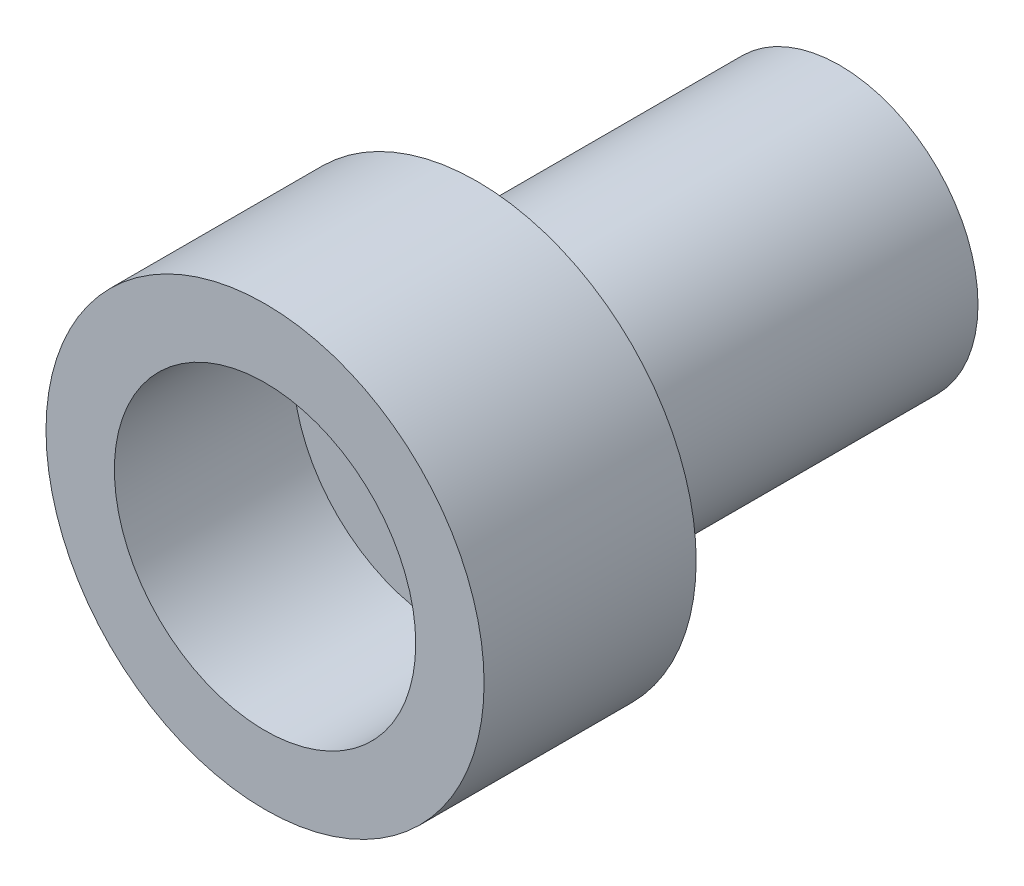
ISO-10303-21;
HEADER;
FILE_DESCRIPTION(('STEP AP214'),'2;1');
FILE_NAME('part.step','',(''),(''),'','','');
FILE_SCHEMA(('AUTOMOTIVE_DESIGN { 1 0 10303 214 1 1 1 1 }'));
ENDSEC;
DATA;
#1=APPLICATION_CONTEXT('core data for automotive mechanical design processes');
#2=APPLICATION_PROTOCOL_DEFINITION('international standard','automotive_design',2000,#1);
#3=PRODUCT_CONTEXT('',#1,'mechanical');
#4=PRODUCT('Part','Part','',(#3));
#5=PRODUCT_RELATED_PRODUCT_CATEGORY('part','',(#4));
#6=PRODUCT_DEFINITION_FORMATION('','',#4);
#7=PRODUCT_DEFINITION_CONTEXT('part definition',#1,'design');
#8=PRODUCT_DEFINITION('design','',#6,#7);
#9=PRODUCT_DEFINITION_SHAPE('','',#8);
#10=(LENGTH_UNIT() NAMED_UNIT(*) SI_UNIT(.MILLI.,.METRE.));
#11=(NAMED_UNIT(*) PLANE_ANGLE_UNIT() SI_UNIT($,.RADIAN.));
#12=(NAMED_UNIT(*) SI_UNIT($,.STERADIAN.) SOLID_ANGLE_UNIT());
#13=UNCERTAINTY_MEASURE_WITH_UNIT(LENGTH_MEASURE(1.E-05),#10,'distance_accuracy_value','');
#14=(GEOMETRIC_REPRESENTATION_CONTEXT(3) GLOBAL_UNCERTAINTY_ASSIGNED_CONTEXT((#13)) GLOBAL_UNIT_ASSIGNED_CONTEXT((#10,
#11,#12)) REPRESENTATION_CONTEXT('',''));
#15=CARTESIAN_POINT('',(0.,0.,0.));
#16=DIRECTION('',(0.,0.,1.));
#17=DIRECTION('',(1.,0.,0.));
#18=AXIS2_PLACEMENT_3D('',#15,#16,#17);
#19=CARTESIAN_POINT('',(0.,2.7,3.8));
#20=DIRECTION('',(0.,0.,-1.));
#21=DIRECTION('',(-1.,0.,0.));
#22=AXIS2_PLACEMENT_3D('',#19,#20,#21);
#23=PLANE('',#22);
#24=CARTESIAN_POINT('',(0.,0.,3.8));
#25=DIRECTION('',(0.,0.,1.));
#26=DIRECTION('',(1.,0.,0.));
#27=AXIS2_PLACEMENT_3D('',#24,#25,#26);
#28=CIRCLE('',#27,2.7);
#29=CARTESIAN_POINT('',(2.7,0.,3.8));
#30=VERTEX_POINT('',#29);
#31=EDGE_CURVE('E61',#30,#30,#28,.T.);
#32=ORIENTED_EDGE('',*,*,#31,.F.);
#33=EDGE_LOOP('',(#32));
#34=FACE_BOUND('',#33,.T.);
#35=CARTESIAN_POINT('',(0.,0.,3.8));
#36=DIRECTION('',(0.,0.,1.));
#37=DIRECTION('',(1.,0.,0.));
#38=AXIS2_PLACEMENT_3D('',#35,#36,#37);
#39=CIRCLE('',#38,3.925);
#40=CARTESIAN_POINT('',(3.925,0.,3.8));
#41=VERTEX_POINT('',#40);
#42=EDGE_CURVE('E10',#41,#41,#39,.T.);
#43=ORIENTED_EDGE('',*,*,#42,.T.);
#44=EDGE_LOOP('',(#43));
#45=FACE_BOUND('',#44,.T.);
#46=ADVANCED_FACE('F33',(#34,#45),#23,.F.);
#47=CARTESIAN_POINT('',(0.,0.,10.7125138928134));
#48=DIRECTION('',(0.,0.,1.));
#49=DIRECTION('',(1.,0.,0.));
#50=AXIS2_PLACEMENT_3D('',#47,#48,#49);
#51=CYLINDRICAL_SURFACE('',#50,3.925);
#52=ORIENTED_EDGE('',*,*,#42,.F.);
#53=EDGE_LOOP('',(#52));
#54=FACE_BOUND('',#53,.T.);
#55=CARTESIAN_POINT('',(0.,0.,0.));
#56=DIRECTION('',(0.,0.,1.));
#57=DIRECTION('',(1.,0.,0.));
#58=AXIS2_PLACEMENT_3D('',#55,#56,#57);
#59=CIRCLE('',#58,3.925);
#60=CARTESIAN_POINT('',(3.925,0.,0.));
#61=VERTEX_POINT('',#60);
#62=EDGE_CURVE('E39',#61,#61,#59,.T.);
#63=ORIENTED_EDGE('',*,*,#62,.T.);
#64=EDGE_LOOP('',(#63));
#65=FACE_BOUND('',#64,.T.);
#66=ADVANCED_FACE('F68',(#54,#65),#51,.T.);
#67=CARTESIAN_POINT('',(0.,3.925,0.));
#68=DIRECTION('',(0.,0.,1.));
#69=DIRECTION('',(1.,0.,0.));
#70=AXIS2_PLACEMENT_3D('',#67,#68,#69);
#71=PLANE('',#70);
#72=ORIENTED_EDGE('',*,*,#62,.F.);
#73=EDGE_LOOP('',(#72));
#74=FACE_BOUND('',#73,.T.);
#75=CARTESIAN_POINT('',(0.,0.,0.));
#76=DIRECTION('',(0.,0.,1.));
#77=DIRECTION('',(1.,0.,0.));
#78=AXIS2_PLACEMENT_3D('',#75,#76,#77);
#79=CIRCLE('',#78,2.475);
#80=CARTESIAN_POINT('',(2.475,0.,0.));
#81=VERTEX_POINT('',#80);
#82=EDGE_CURVE('E43',#81,#81,#79,.T.);
#83=ORIENTED_EDGE('',*,*,#82,.T.);
#84=EDGE_LOOP('',(#83));
#85=FACE_BOUND('',#84,.T.);
#86=ADVANCED_FACE('F72',(#74,#85),#71,.F.);
#87=CARTESIAN_POINT('',(0.,0.,10.7125138928134));
#88=DIRECTION('',(0.,0.,1.));
#89=DIRECTION('',(1.,0.,0.));
#90=AXIS2_PLACEMENT_3D('',#87,#88,#89);
#91=CYLINDRICAL_SURFACE('',#90,2.475);
#92=ORIENTED_EDGE('',*,*,#82,.F.);
#93=EDGE_LOOP('',(#92));
#94=FACE_BOUND('',#93,.T.);
#95=CARTESIAN_POINT('',(0.,0.,-6.5));
#96=DIRECTION('',(0.,0.,1.));
#97=DIRECTION('',(1.,0.,0.));
#98=AXIS2_PLACEMENT_3D('',#95,#96,#97);
#99=CIRCLE('',#98,2.475);
#100=CARTESIAN_POINT('',(2.475,0.,-6.5));
#101=VERTEX_POINT('',#100);
#102=EDGE_CURVE('E47',#101,#101,#99,.T.);
#103=ORIENTED_EDGE('',*,*,#102,.T.);
#104=EDGE_LOOP('',(#103));
#105=FACE_BOUND('',#104,.T.);
#106=ADVANCED_FACE('F77',(#94,#105),#91,.T.);
#107=CARTESIAN_POINT('',(0.,2.475,-6.5));
#108=DIRECTION('',(0.,0.,1.));
#109=DIRECTION('',(1.,0.,0.));
#110=AXIS2_PLACEMENT_3D('',#107,#108,#109);
#111=PLANE('',#110);
#112=ORIENTED_EDGE('',*,*,#102,.F.);
#113=EDGE_LOOP('',(#112));
#114=FACE_BOUND('',#113,.T.);
#115=CARTESIAN_POINT('',(0.,0.,-6.5));
#116=DIRECTION('',(0.,0.,1.));
#117=DIRECTION('',(1.,0.,0.));
#118=AXIS2_PLACEMENT_3D('',#115,#116,#117);
#119=CIRCLE('',#118,1.45);
#120=CARTESIAN_POINT('',(1.45,0.,-6.5));
#121=VERTEX_POINT('',#120);
#122=EDGE_CURVE('E52',#121,#121,#119,.T.);
#123=ORIENTED_EDGE('',*,*,#122,.T.);
#124=EDGE_LOOP('',(#123));
#125=FACE_BOUND('',#124,.T.);
#126=ADVANCED_FACE('F83',(#114,#125),#111,.F.);
#127=CARTESIAN_POINT('',(0.,0.,10.7125138928134));
#128=DIRECTION('',(0.,0.,1.));
#129=DIRECTION('',(1.,0.,0.));
#130=AXIS2_PLACEMENT_3D('',#127,#128,#129);
#131=CYLINDRICAL_SURFACE('',#130,1.45);
#132=ORIENTED_EDGE('',*,*,#122,.F.);
#133=EDGE_LOOP('',(#132));
#134=FACE_BOUND('',#133,.T.);
#135=CARTESIAN_POINT('',(0.,0.,0.6));
#136=DIRECTION('',(0.,0.,1.));
#137=DIRECTION('',(1.,0.,0.));
#138=AXIS2_PLACEMENT_3D('',#135,#136,#137);
#139=CIRCLE('',#138,1.45);
#140=CARTESIAN_POINT('',(1.45,0.,0.6));
#141=VERTEX_POINT('',#140);
#142=EDGE_CURVE('E55',#141,#141,#139,.T.);
#143=ORIENTED_EDGE('',*,*,#142,.T.);
#144=EDGE_LOOP('',(#143));
#145=FACE_BOUND('',#144,.T.);
#146=ADVANCED_FACE('F87',(#134,#145),#131,.F.);
#147=CARTESIAN_POINT('',(0.,2.7,0.6));
#148=DIRECTION('',(0.,0.,-1.));
#149=DIRECTION('',(-1.,0.,0.));
#150=AXIS2_PLACEMENT_3D('',#147,#148,#149);
#151=PLANE('',#150);
#152=ORIENTED_EDGE('',*,*,#142,.F.);
#153=EDGE_LOOP('',(#152));
#154=FACE_BOUND('',#153,.T.);
#155=CARTESIAN_POINT('',(0.,0.,0.6));
#156=DIRECTION('',(0.,0.,1.));
#157=DIRECTION('',(1.,0.,0.));
#158=AXIS2_PLACEMENT_3D('',#155,#156,#157);
#159=CIRCLE('',#158,2.7);
#160=CARTESIAN_POINT('',(2.7,0.,0.6));
#161=VERTEX_POINT('',#160);
#162=EDGE_CURVE('E58',#161,#161,#159,.T.);
#163=ORIENTED_EDGE('',*,*,#162,.T.);
#164=EDGE_LOOP('',(#163));
#165=FACE_BOUND('',#164,.T.);
#166=ADVANCED_FACE('F91',(#154,#165),#151,.F.);
#167=CARTESIAN_POINT('',(0.,0.,10.7125138928134));
#168=DIRECTION('',(0.,0.,1.));
#169=DIRECTION('',(1.,0.,0.));
#170=AXIS2_PLACEMENT_3D('',#167,#168,#169);
#171=CYLINDRICAL_SURFACE('',#170,2.7);
#172=ORIENTED_EDGE('',*,*,#162,.F.);
#173=EDGE_LOOP('',(#172));
#174=FACE_BOUND('',#173,.T.);
#175=ORIENTED_EDGE('',*,*,#31,.T.);
#176=EDGE_LOOP('',(#175));
#177=FACE_BOUND('',#176,.T.);
#178=ADVANCED_FACE('F65',(#174,#177),#171,.F.);
#179=CLOSED_SHELL('',(#46,#66,#86,#106,#126,#146,#166,#178));
#180=MANIFOLD_SOLID_BREP('B2',#179);
#181=ADVANCED_BREP_SHAPE_REPRESENTATION('',(#18,#180),#14);
#182=SHAPE_DEFINITION_REPRESENTATION(#9,#181);
ENDSEC;
END-ISO-10303-21;
